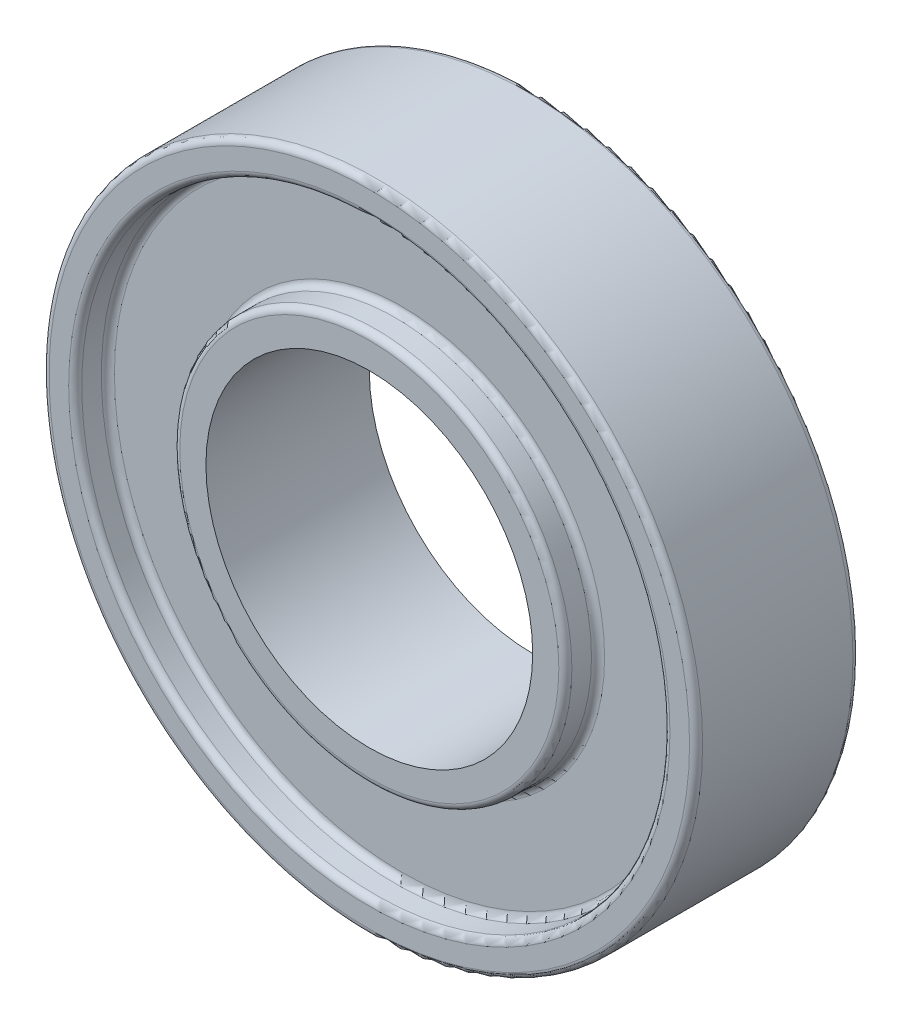
ISO-10303-21;
HEADER;
FILE_DESCRIPTION(('STEP AP214'),'2;1');
FILE_NAME('part.step','',(''),(''),'','','');
FILE_SCHEMA(('AUTOMOTIVE_DESIGN { 1 0 10303 214 1 1 1 1 }'));
ENDSEC;
DATA;
#1=APPLICATION_CONTEXT('core data for automotive mechanical design processes');
#2=APPLICATION_PROTOCOL_DEFINITION('international standard','automotive_design',2000,#1);
#3=PRODUCT_CONTEXT('',#1,'mechanical');
#4=PRODUCT('Part','Part','',(#3));
#5=PRODUCT_RELATED_PRODUCT_CATEGORY('part','',(#4));
#6=PRODUCT_DEFINITION_FORMATION('','',#4);
#7=PRODUCT_DEFINITION_CONTEXT('part definition',#1,'design');
#8=PRODUCT_DEFINITION('design','',#6,#7);
#9=PRODUCT_DEFINITION_SHAPE('','',#8);
#10=(LENGTH_UNIT() NAMED_UNIT(*) SI_UNIT(.MILLI.,.METRE.));
#11=(NAMED_UNIT(*) PLANE_ANGLE_UNIT() SI_UNIT($,.RADIAN.));
#12=(NAMED_UNIT(*) SI_UNIT($,.STERADIAN.) SOLID_ANGLE_UNIT());
#13=UNCERTAINTY_MEASURE_WITH_UNIT(LENGTH_MEASURE(1.E-05),#10,'distance_accuracy_value','');
#14=(GEOMETRIC_REPRESENTATION_CONTEXT(3) GLOBAL_UNCERTAINTY_ASSIGNED_CONTEXT((#13)) GLOBAL_UNIT_ASSIGNED_CONTEXT((#10,
#11,#12)) REPRESENTATION_CONTEXT('',''));
#15=CARTESIAN_POINT('',(0.,0.,0.));
#16=DIRECTION('',(0.,0.,1.));
#17=DIRECTION('',(1.,0.,0.));
#18=AXIS2_PLACEMENT_3D('',#15,#16,#17);
#19=CARTESIAN_POINT('',(0.,0.,0.));
#20=DIRECTION('',(0.,0.,1.));
#21=DIRECTION('',(1.,0.,0.));
#22=AXIS2_PLACEMENT_3D('',#19,#20,#21);
#23=PLANE('',#22);
#24=CARTESIAN_POINT('',(0.,0.,0.));
#25=DIRECTION('',(0.,0.,1.));
#26=DIRECTION('',(1.,0.,0.));
#27=AXIS2_PLACEMENT_3D('',#24,#25,#26);
#28=CIRCLE('',#27,5.8);
#29=CARTESIAN_POINT('',(5.8,0.,0.));
#30=VERTEX_POINT('',#29);
#31=EDGE_CURVE('E75',#30,#30,#28,.F.);
#32=ORIENTED_EDGE('',*,*,#31,.T.);
#33=EDGE_LOOP('',(#32));
#34=FACE_BOUND('',#33,.T.);
#35=CARTESIAN_POINT('',(0.,0.,0.));
#36=DIRECTION('',(0.,0.,1.));
#37=DIRECTION('',(1.,0.,0.));
#38=AXIS2_PLACEMENT_3D('',#35,#36,#37);
#39=CIRCLE('',#38,5.);
#40=CARTESIAN_POINT('',(5.,0.,0.));
#41=VERTEX_POINT('',#40);
#42=EDGE_CURVE('E103',#41,#41,#39,.T.);
#43=ORIENTED_EDGE('',*,*,#42,.T.);
#44=EDGE_LOOP('',(#43));
#45=FACE_BOUND('',#44,.T.);
#46=ADVANCED_FACE('F34',(#34,#45),#23,.F.);
#47=CARTESIAN_POINT('',(0.,0.,5.));
#48=DIRECTION('',(0.,0.,1.));
#49=DIRECTION('',(1.,0.,0.));
#50=AXIS2_PLACEMENT_3D('',#47,#48,#49);
#51=PLANE('',#50);
#52=CARTESIAN_POINT('',(0.,0.,5.));
#53=DIRECTION('',(0.,0.,1.));
#54=DIRECTION('',(1.,0.,0.));
#55=AXIS2_PLACEMENT_3D('',#52,#53,#54);
#56=CIRCLE('',#55,5.8);
#57=CARTESIAN_POINT('',(5.8,0.,5.));
#58=VERTEX_POINT('',#57);
#59=EDGE_CURVE('E10',#58,#58,#56,.T.);
#60=ORIENTED_EDGE('',*,*,#59,.T.);
#61=EDGE_LOOP('',(#60));
#62=FACE_BOUND('',#61,.T.);
#63=CARTESIAN_POINT('',(0.,0.,5.));
#64=DIRECTION('',(0.,0.,1.));
#65=DIRECTION('',(1.,0.,0.));
#66=AXIS2_PLACEMENT_3D('',#63,#64,#65);
#67=CIRCLE('',#66,5.);
#68=CARTESIAN_POINT('',(5.,0.,5.));
#69=VERTEX_POINT('',#68);
#70=EDGE_CURVE('E102',#69,#69,#67,.T.);
#71=ORIENTED_EDGE('',*,*,#70,.F.);
#72=EDGE_LOOP('',(#71));
#73=FACE_BOUND('',#72,.T.);
#74=ADVANCED_FACE('F112',(#62,#73),#51,.T.);
#75=CARTESIAN_POINT('',(0.,0.,5.));
#76=DIRECTION('',(0.,0.,1.));
#77=DIRECTION('',(1.,0.,0.));
#78=AXIS2_PLACEMENT_3D('',#75,#76,#77);
#79=CIRCLE('',#78,9.8);
#80=CARTESIAN_POINT('',(9.8,0.,5.));
#81=VERTEX_POINT('',#80);
#82=EDGE_CURVE('E41',#81,#81,#79,.T.);
#83=ORIENTED_EDGE('',*,*,#82,.T.);
#84=EDGE_LOOP('',(#83));
#85=FACE_BOUND('',#84,.T.);
#86=CARTESIAN_POINT('',(0.,0.,5.));
#87=DIRECTION('',(0.,0.,1.));
#88=DIRECTION('',(1.,0.,0.));
#89=AXIS2_PLACEMENT_3D('',#86,#87,#88);
#90=CIRCLE('',#89,9.2);
#91=CARTESIAN_POINT('',(9.2,0.,5.));
#92=VERTEX_POINT('',#91);
#93=EDGE_CURVE('E45',#92,#92,#90,.F.);
#94=ORIENTED_EDGE('',*,*,#93,.T.);
#95=EDGE_LOOP('',(#94));
#96=FACE_BOUND('',#95,.T.);
#97=ADVANCED_FACE('F114',(#85,#96),#51,.T.);
#98=CARTESIAN_POINT('',(0.,0.,0.));
#99=DIRECTION('',(0.,0.,1.));
#100=DIRECTION('',(1.,0.,0.));
#101=AXIS2_PLACEMENT_3D('',#98,#99,#100);
#102=CIRCLE('',#101,9.2);
#103=CARTESIAN_POINT('',(9.2,0.,0.));
#104=VERTEX_POINT('',#103);
#105=EDGE_CURVE('E96',#104,#104,#102,.T.);
#106=ORIENTED_EDGE('',*,*,#105,.T.);
#107=EDGE_LOOP('',(#106));
#108=FACE_BOUND('',#107,.T.);
#109=CARTESIAN_POINT('',(0.,0.,0.));
#110=DIRECTION('',(0.,0.,1.));
#111=DIRECTION('',(1.,0.,0.));
#112=AXIS2_PLACEMENT_3D('',#109,#110,#111);
#113=CIRCLE('',#112,9.8);
#114=CARTESIAN_POINT('',(9.8,0.,0.));
#115=VERTEX_POINT('',#114);
#116=EDGE_CURVE('E99',#115,#115,#113,.F.);
#117=ORIENTED_EDGE('',*,*,#116,.T.);
#118=EDGE_LOOP('',(#117));
#119=FACE_BOUND('',#118,.T.);
#120=ADVANCED_FACE('F120',(#108,#119),#23,.F.);
#121=CARTESIAN_POINT('',(0.,0.,5.));
#122=DIRECTION('',(0.,0.,-1.));
#123=DIRECTION('',(-1.,0.,0.));
#124=AXIS2_PLACEMENT_3D('',#121,#122,#123);
#125=CYLINDRICAL_SURFACE('',#124,10.);
#126=CARTESIAN_POINT('',(0.,0.,0.2));
#127=DIRECTION('',(0.,0.,1.));
#128=DIRECTION('',(1.,0.,0.));
#129=AXIS2_PLACEMENT_3D('',#126,#127,#128);
#130=CIRCLE('',#129,10.);
#131=CARTESIAN_POINT('',(10.,0.,0.2));
#132=VERTEX_POINT('',#131);
#133=EDGE_CURVE('E49',#132,#132,#130,.T.);
#134=ORIENTED_EDGE('',*,*,#133,.T.);
#135=EDGE_LOOP('',(#134));
#136=FACE_BOUND('',#135,.T.);
#137=CARTESIAN_POINT('',(0.,0.,4.8));
#138=DIRECTION('',(0.,0.,1.));
#139=DIRECTION('',(1.,0.,0.));
#140=AXIS2_PLACEMENT_3D('',#137,#138,#139);
#141=CIRCLE('',#140,10.);
#142=CARTESIAN_POINT('',(10.,0.,4.8));
#143=VERTEX_POINT('',#142);
#144=EDGE_CURVE('E54',#143,#143,#141,.F.);
#145=ORIENTED_EDGE('',*,*,#144,.T.);
#146=EDGE_LOOP('',(#145));
#147=FACE_BOUND('',#146,.T.);
#148=ADVANCED_FACE('F127',(#136,#147),#125,.T.);
#149=CARTESIAN_POINT('',(0.,0.,5.));
#150=DIRECTION('',(0.,0.,-1.));
#151=DIRECTION('',(-1.,0.,0.));
#152=AXIS2_PLACEMENT_3D('',#149,#150,#151);
#153=CYLINDRICAL_SURFACE('',#152,5.);
#154=ORIENTED_EDGE('',*,*,#70,.T.);
#155=EDGE_LOOP('',(#154));
#156=FACE_BOUND('',#155,.T.);
#157=ORIENTED_EDGE('',*,*,#42,.F.);
#158=EDGE_LOOP('',(#157));
#159=FACE_BOUND('',#158,.T.);
#160=ADVANCED_FACE('F109',(#156,#159),#153,.F.);
#161=CARTESIAN_POINT('',(0.,0.,4.));
#162=DIRECTION('',(0.,0.,1.));
#163=DIRECTION('',(1.,0.,0.));
#164=AXIS2_PLACEMENT_3D('',#161,#162,#163);
#165=CYLINDRICAL_SURFACE('',#164,9.);
#166=CARTESIAN_POINT('',(0.,0.,4.2));
#167=DIRECTION('',(0.,0.,1.));
#168=DIRECTION('',(1.,0.,0.));
#169=AXIS2_PLACEMENT_3D('',#166,#167,#168);
#170=CIRCLE('',#169,9.);
#171=CARTESIAN_POINT('',(9.,0.,4.2));
#172=VERTEX_POINT('',#171);
#173=EDGE_CURVE('E63',#172,#172,#170,.F.);
#174=ORIENTED_EDGE('',*,*,#173,.T.);
#175=EDGE_LOOP('',(#174));
#176=FACE_BOUND('',#175,.T.);
#177=CARTESIAN_POINT('',(0.,0.,4.8));
#178=DIRECTION('',(0.,0.,1.));
#179=DIRECTION('',(1.,0.,0.));
#180=AXIS2_PLACEMENT_3D('',#177,#178,#179);
#181=CIRCLE('',#180,9.);
#182=CARTESIAN_POINT('',(9.,0.,4.8));
#183=VERTEX_POINT('',#182);
#184=EDGE_CURVE('E66',#183,#183,#181,.T.);
#185=ORIENTED_EDGE('',*,*,#184,.T.);
#186=EDGE_LOOP('',(#185));
#187=FACE_BOUND('',#186,.T.);
#188=ADVANCED_FACE('F175',(#176,#187),#165,.F.);
#189=CARTESIAN_POINT('',(0.,0.,4.));
#190=DIRECTION('',(0.,0.,1.));
#191=DIRECTION('',(1.,0.,0.));
#192=AXIS2_PLACEMENT_3D('',#189,#190,#191);
#193=PLANE('',#192);
#194=CARTESIAN_POINT('',(0.,0.,4.));
#195=DIRECTION('',(0.,0.,1.));
#196=DIRECTION('',(1.,0.,0.));
#197=AXIS2_PLACEMENT_3D('',#194,#195,#196);
#198=CIRCLE('',#197,8.8);
#199=CARTESIAN_POINT('',(8.8,0.,4.));
#200=VERTEX_POINT('',#199);
#201=EDGE_CURVE('E69',#200,#200,#198,.T.);
#202=ORIENTED_EDGE('',*,*,#201,.T.);
#203=EDGE_LOOP('',(#202));
#204=FACE_BOUND('',#203,.T.);
#205=CARTESIAN_POINT('',(0.,0.,4.));
#206=DIRECTION('',(0.,0.,1.));
#207=DIRECTION('',(1.,0.,0.));
#208=AXIS2_PLACEMENT_3D('',#205,#206,#207);
#209=CIRCLE('',#208,6.2);
#210=CARTESIAN_POINT('',(6.2,0.,4.));
#211=VERTEX_POINT('',#210);
#212=EDGE_CURVE('E72',#211,#211,#209,.F.);
#213=ORIENTED_EDGE('',*,*,#212,.T.);
#214=EDGE_LOOP('',(#213));
#215=FACE_BOUND('',#214,.T.);
#216=ADVANCED_FACE('F177',(#204,#215),#193,.T.);
#217=CARTESIAN_POINT('',(0.,0.,4.));
#218=DIRECTION('',(0.,0.,1.));
#219=DIRECTION('',(1.,0.,0.));
#220=AXIS2_PLACEMENT_3D('',#217,#218,#219);
#221=CYLINDRICAL_SURFACE('',#220,6.);
#222=CARTESIAN_POINT('',(0.,0.,4.2));
#223=DIRECTION('',(0.,0.,1.));
#224=DIRECTION('',(1.,0.,0.));
#225=AXIS2_PLACEMENT_3D('',#222,#223,#224);
#226=CIRCLE('',#225,6.);
#227=CARTESIAN_POINT('',(6.,0.,4.2));
#228=VERTEX_POINT('',#227);
#229=EDGE_CURVE('E57',#228,#228,#226,.T.);
#230=ORIENTED_EDGE('',*,*,#229,.T.);
#231=EDGE_LOOP('',(#230));
#232=FACE_BOUND('',#231,.T.);
#233=CARTESIAN_POINT('',(0.,0.,4.8));
#234=DIRECTION('',(0.,0.,1.));
#235=DIRECTION('',(1.,0.,0.));
#236=AXIS2_PLACEMENT_3D('',#233,#234,#235);
#237=CIRCLE('',#236,6.);
#238=CARTESIAN_POINT('',(6.,0.,4.8));
#239=VERTEX_POINT('',#238);
#240=EDGE_CURVE('E60',#239,#239,#237,.F.);
#241=ORIENTED_EDGE('',*,*,#240,.T.);
#242=EDGE_LOOP('',(#241));
#243=FACE_BOUND('',#242,.T.);
#244=ADVANCED_FACE('F183',(#232,#243),#221,.T.);
#245=CARTESIAN_POINT('',(0.,0.,1.));
#246=DIRECTION('',(0.,0.,-1.));
#247=DIRECTION('',(1.,0.,0.));
#248=AXIS2_PLACEMENT_3D('',#245,#246,#247);
#249=PLANE('',#248);
#250=CARTESIAN_POINT('',(0.,0.,1.));
#251=DIRECTION('',(0.,0.,-1.));
#252=DIRECTION('',(-1.,0.,0.));
#253=AXIS2_PLACEMENT_3D('',#250,#251,#252);
#254=CIRCLE('',#253,8.8);
#255=CARTESIAN_POINT('',(-8.8,0.,1.));
#256=VERTEX_POINT('',#255);
#257=EDGE_CURVE('E84',#256,#256,#254,.T.);
#258=ORIENTED_EDGE('',*,*,#257,.T.);
#259=EDGE_LOOP('',(#258));
#260=FACE_BOUND('',#259,.T.);
#261=CARTESIAN_POINT('',(0.,0.,1.));
#262=DIRECTION('',(0.,0.,-1.));
#263=DIRECTION('',(-1.,0.,0.));
#264=AXIS2_PLACEMENT_3D('',#261,#262,#263);
#265=CIRCLE('',#264,6.2);
#266=CARTESIAN_POINT('',(-6.2,0.,1.));
#267=VERTEX_POINT('',#266);
#268=EDGE_CURVE('E87',#267,#267,#265,.F.);
#269=ORIENTED_EDGE('',*,*,#268,.T.);
#270=EDGE_LOOP('',(#269));
#271=FACE_BOUND('',#270,.T.);
#272=ADVANCED_FACE('F189',(#260,#271),#249,.T.);
#273=CARTESIAN_POINT('',(0.,0.,1.));
#274=DIRECTION('',(0.,0.,-1.));
#275=DIRECTION('',(-1.,0.,0.));
#276=AXIS2_PLACEMENT_3D('',#273,#274,#275);
#277=CYLINDRICAL_SURFACE('',#276,9.);
#278=CARTESIAN_POINT('',(0.,0.,0.2));
#279=DIRECTION('',(0.,0.,1.));
#280=DIRECTION('',(1.,0.,0.));
#281=AXIS2_PLACEMENT_3D('',#278,#279,#280);
#282=CIRCLE('',#281,9.);
#283=CARTESIAN_POINT('',(9.,0.,0.2));
#284=VERTEX_POINT('',#283);
#285=EDGE_CURVE('E90',#284,#284,#282,.F.);
#286=ORIENTED_EDGE('',*,*,#285,.T.);
#287=EDGE_LOOP('',(#286));
#288=FACE_BOUND('',#287,.T.);
#289=CARTESIAN_POINT('',(0.,0.,0.8));
#290=DIRECTION('',(0.,0.,-1.));
#291=DIRECTION('',(-1.,0.,0.));
#292=AXIS2_PLACEMENT_3D('',#289,#290,#291);
#293=CIRCLE('',#292,9.);
#294=CARTESIAN_POINT('',(-9.,0.,0.8));
#295=VERTEX_POINT('',#294);
#296=EDGE_CURVE('E93',#295,#295,#293,.F.);
#297=ORIENTED_EDGE('',*,*,#296,.T.);
#298=EDGE_LOOP('',(#297));
#299=FACE_BOUND('',#298,.T.);
#300=ADVANCED_FACE('F191',(#288,#299),#277,.F.);
#301=CARTESIAN_POINT('',(0.,0.,1.));
#302=DIRECTION('',(0.,0.,-1.));
#303=DIRECTION('',(-1.,0.,0.));
#304=AXIS2_PLACEMENT_3D('',#301,#302,#303);
#305=CYLINDRICAL_SURFACE('',#304,6.);
#306=CARTESIAN_POINT('',(0.,0.,0.2));
#307=DIRECTION('',(0.,0.,1.));
#308=DIRECTION('',(1.,0.,0.));
#309=AXIS2_PLACEMENT_3D('',#306,#307,#308);
#310=CIRCLE('',#309,6.);
#311=CARTESIAN_POINT('',(6.,0.,0.2));
#312=VERTEX_POINT('',#311);
#313=EDGE_CURVE('E78',#312,#312,#310,.T.);
#314=ORIENTED_EDGE('',*,*,#313,.T.);
#315=EDGE_LOOP('',(#314));
#316=FACE_BOUND('',#315,.T.);
#317=CARTESIAN_POINT('',(0.,0.,0.8));
#318=DIRECTION('',(0.,0.,-1.));
#319=DIRECTION('',(-1.,0.,0.));
#320=AXIS2_PLACEMENT_3D('',#317,#318,#319);
#321=CIRCLE('',#320,6.);
#322=CARTESIAN_POINT('',(-6.,0.,0.8));
#323=VERTEX_POINT('',#322);
#324=EDGE_CURVE('E81',#323,#323,#321,.T.);
#325=ORIENTED_EDGE('',*,*,#324,.T.);
#326=EDGE_LOOP('',(#325));
#327=FACE_BOUND('',#326,.T.);
#328=ADVANCED_FACE('F136',(#316,#327),#305,.T.);
#329=CARTESIAN_POINT('',(0.,0.,0.2));
#330=DIRECTION('',(0.,0.,1.));
#331=DIRECTION('',(1.,0.,0.));
#332=AXIS2_PLACEMENT_3D('',#329,#330,#331);
#333=TOROIDAL_SURFACE('',#332,9.2,0.2);
#334=ORIENTED_EDGE('',*,*,#285,.F.);
#335=EDGE_LOOP('',(#334));
#336=FACE_BOUND('',#335,.T.);
#337=ORIENTED_EDGE('',*,*,#105,.F.);
#338=EDGE_LOOP('',(#337));
#339=FACE_BOUND('',#338,.T.);
#340=ADVANCED_FACE('F132',(#336,#339),#333,.T.);
#341=CARTESIAN_POINT('',(0.,0.,0.8));
#342=DIRECTION('',(0.,0.,-1.));
#343=DIRECTION('',(-1.,0.,0.));
#344=AXIS2_PLACEMENT_3D('',#341,#342,#343);
#345=TOROIDAL_SURFACE('',#344,8.8,0.2);
#346=ORIENTED_EDGE('',*,*,#257,.F.);
#347=EDGE_LOOP('',(#346));
#348=FACE_BOUND('',#347,.T.);
#349=ORIENTED_EDGE('',*,*,#296,.F.);
#350=EDGE_LOOP('',(#349));
#351=FACE_BOUND('',#350,.T.);
#352=ADVANCED_FACE('F135',(#348,#351),#345,.F.);
#353=CARTESIAN_POINT('',(0.,0.,0.2));
#354=DIRECTION('',(0.,0.,1.));
#355=DIRECTION('',(1.,0.,0.));
#356=AXIS2_PLACEMENT_3D('',#353,#354,#355);
#357=TOROIDAL_SURFACE('',#356,5.8,0.2);
#358=ORIENTED_EDGE('',*,*,#31,.F.);
#359=EDGE_LOOP('',(#358));
#360=FACE_BOUND('',#359,.T.);
#361=ORIENTED_EDGE('',*,*,#313,.F.);
#362=EDGE_LOOP('',(#361));
#363=FACE_BOUND('',#362,.T.);
#364=ADVANCED_FACE('F140',(#360,#363),#357,.T.);
#365=CARTESIAN_POINT('',(0.,0.,0.8));
#366=DIRECTION('',(0.,0.,-1.));
#367=DIRECTION('',(-1.,0.,0.));
#368=AXIS2_PLACEMENT_3D('',#365,#366,#367);
#369=TOROIDAL_SURFACE('',#368,6.2,0.2);
#370=ORIENTED_EDGE('',*,*,#324,.F.);
#371=EDGE_LOOP('',(#370));
#372=FACE_BOUND('',#371,.T.);
#373=ORIENTED_EDGE('',*,*,#268,.F.);
#374=EDGE_LOOP('',(#373));
#375=FACE_BOUND('',#374,.T.);
#376=ADVANCED_FACE('F144',(#372,#375),#369,.F.);
#377=CARTESIAN_POINT('',(0.,0.,4.2));
#378=DIRECTION('',(0.,0.,1.));
#379=DIRECTION('',(1.,0.,0.));
#380=AXIS2_PLACEMENT_3D('',#377,#378,#379);
#381=TOROIDAL_SURFACE('',#380,8.8,0.2);
#382=ORIENTED_EDGE('',*,*,#173,.F.);
#383=EDGE_LOOP('',(#382));
#384=FACE_BOUND('',#383,.T.);
#385=ORIENTED_EDGE('',*,*,#201,.F.);
#386=EDGE_LOOP('',(#385));
#387=FACE_BOUND('',#386,.T.);
#388=ADVANCED_FACE('F148',(#384,#387),#381,.F.);
#389=CARTESIAN_POINT('',(0.,0.,4.2));
#390=DIRECTION('',(0.,0.,1.));
#391=DIRECTION('',(1.,0.,0.));
#392=AXIS2_PLACEMENT_3D('',#389,#390,#391);
#393=TOROIDAL_SURFACE('',#392,6.2,0.2);
#394=ORIENTED_EDGE('',*,*,#212,.F.);
#395=EDGE_LOOP('',(#394));
#396=FACE_BOUND('',#395,.T.);
#397=ORIENTED_EDGE('',*,*,#229,.F.);
#398=EDGE_LOOP('',(#397));
#399=FACE_BOUND('',#398,.T.);
#400=ADVANCED_FACE('F152',(#396,#399),#393,.F.);
#401=CARTESIAN_POINT('',(0.,0.,0.2));
#402=DIRECTION('',(0.,0.,1.));
#403=DIRECTION('',(1.,0.,0.));
#404=AXIS2_PLACEMENT_3D('',#401,#402,#403);
#405=TOROIDAL_SURFACE('',#404,9.8,0.2);
#406=ORIENTED_EDGE('',*,*,#116,.F.);
#407=EDGE_LOOP('',(#406));
#408=FACE_BOUND('',#407,.T.);
#409=ORIENTED_EDGE('',*,*,#133,.F.);
#410=EDGE_LOOP('',(#409));
#411=FACE_BOUND('',#410,.T.);
#412=ADVANCED_FACE('F156',(#408,#411),#405,.T.);
#413=CARTESIAN_POINT('',(0.,0.,4.8));
#414=DIRECTION('',(0.,0.,1.));
#415=DIRECTION('',(1.,0.,0.));
#416=AXIS2_PLACEMENT_3D('',#413,#414,#415);
#417=TOROIDAL_SURFACE('',#416,9.8,0.2);
#418=ORIENTED_EDGE('',*,*,#144,.F.);
#419=EDGE_LOOP('',(#418));
#420=FACE_BOUND('',#419,.T.);
#421=ORIENTED_EDGE('',*,*,#82,.F.);
#422=EDGE_LOOP('',(#421));
#423=FACE_BOUND('',#422,.T.);
#424=ADVANCED_FACE('F160',(#420,#423),#417,.T.);
#425=CARTESIAN_POINT('',(0.,0.,4.8));
#426=DIRECTION('',(0.,0.,1.));
#427=DIRECTION('',(1.,0.,0.));
#428=AXIS2_PLACEMENT_3D('',#425,#426,#427);
#429=TOROIDAL_SURFACE('',#428,9.2,0.2);
#430=ORIENTED_EDGE('',*,*,#93,.F.);
#431=EDGE_LOOP('',(#430));
#432=FACE_BOUND('',#431,.T.);
#433=ORIENTED_EDGE('',*,*,#184,.F.);
#434=EDGE_LOOP('',(#433));
#435=FACE_BOUND('',#434,.T.);
#436=ADVANCED_FACE('F163',(#432,#435),#429,.T.);
#437=CARTESIAN_POINT('',(0.,0.,4.8));
#438=DIRECTION('',(0.,0.,1.));
#439=DIRECTION('',(1.,0.,0.));
#440=AXIS2_PLACEMENT_3D('',#437,#438,#439);
#441=TOROIDAL_SURFACE('',#440,5.8,0.2);
#442=ORIENTED_EDGE('',*,*,#240,.F.);
#443=EDGE_LOOP('',(#442));
#444=FACE_BOUND('',#443,.T.);
#445=ORIENTED_EDGE('',*,*,#59,.F.);
#446=EDGE_LOOP('',(#445));
#447=FACE_BOUND('',#446,.T.);
#448=ADVANCED_FACE('F36',(#444,#447),#441,.T.);
#449=CLOSED_SHELL('',(#46,#74,#97,#120,#148,#160,#188,#216,#244,#272,#300,#328,#340,#352,#364,
#376,#388,#400,#412,#424,#436,#448));
#450=MANIFOLD_SOLID_BREP('B2',#449);
#451=ADVANCED_BREP_SHAPE_REPRESENTATION('',(#18,#450),#14);
#452=SHAPE_DEFINITION_REPRESENTATION(#9,#451);
ENDSEC;
END-ISO-10303-21;
